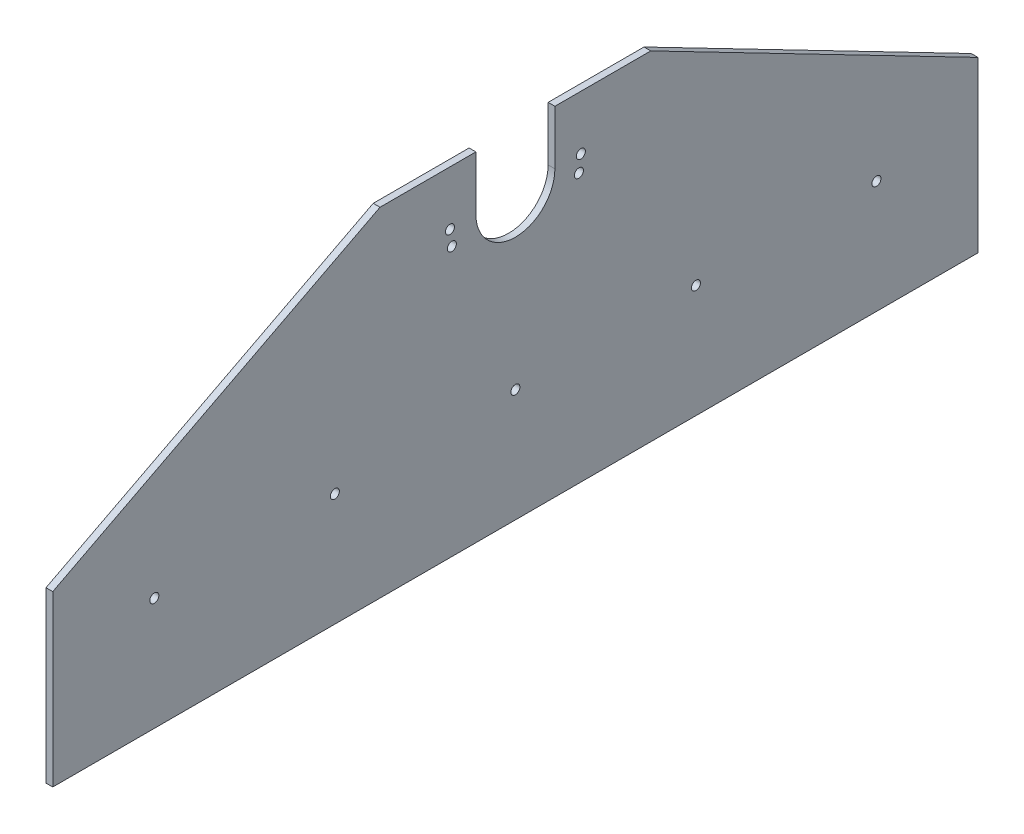
ISO-10303-21;
HEADER;
FILE_DESCRIPTION(('STEP AP214'),'2;1');
FILE_NAME('part.step','',(''),(''),'','','');
FILE_SCHEMA(('AUTOMOTIVE_DESIGN { 1 0 10303 214 1 1 1 1 }'));
ENDSEC;
DATA;
#1=APPLICATION_CONTEXT('core data for automotive mechanical design processes');
#2=APPLICATION_PROTOCOL_DEFINITION('international standard','automotive_design',2000,#1);
#3=PRODUCT_CONTEXT('',#1,'mechanical');
#4=PRODUCT('Part','Part','',(#3));
#5=PRODUCT_RELATED_PRODUCT_CATEGORY('part','',(#4));
#6=PRODUCT_DEFINITION_FORMATION('','',#4);
#7=PRODUCT_DEFINITION_CONTEXT('part definition',#1,'design');
#8=PRODUCT_DEFINITION('design','',#6,#7);
#9=PRODUCT_DEFINITION_SHAPE('','',#8);
#10=(LENGTH_UNIT() NAMED_UNIT(*) SI_UNIT(.MILLI.,.METRE.));
#11=(NAMED_UNIT(*) PLANE_ANGLE_UNIT() SI_UNIT($,.RADIAN.));
#12=(NAMED_UNIT(*) SI_UNIT($,.STERADIAN.) SOLID_ANGLE_UNIT());
#13=UNCERTAINTY_MEASURE_WITH_UNIT(LENGTH_MEASURE(1.E-05),#10,'distance_accuracy_value','');
#14=(GEOMETRIC_REPRESENTATION_CONTEXT(3) GLOBAL_UNCERTAINTY_ASSIGNED_CONTEXT((#13)) GLOBAL_UNIT_ASSIGNED_CONTEXT((#10,
#11,#12)) REPRESENTATION_CONTEXT('',''));
#15=CARTESIAN_POINT('',(0.,0.,0.));
#16=DIRECTION('',(0.,0.,1.));
#17=DIRECTION('',(1.,0.,0.));
#18=AXIS2_PLACEMENT_3D('',#15,#16,#17);
#19=CARTESIAN_POINT('',(3.,150.,0.));
#20=DIRECTION('',(0.,-1.,0.));
#21=DIRECTION('',(0.,0.,-1.));
#22=AXIS2_PLACEMENT_3D('',#19,#20,#21);
#23=PLANE('',#22);
#24=DIRECTION('',(0.,0.,1.));
#25=VECTOR('',#24,1.);
#26=CARTESIAN_POINT('',(3.,150.,0.));
#27=LINE('',#26,#25);
#28=CARTESIAN_POINT('',(3.,150.,-187.5));
#29=VERTEX_POINT('',#28);
#30=CARTESIAN_POINT('',(3.,150.,-145.));
#31=VERTEX_POINT('',#30);
#32=EDGE_CURVE('E202',#29,#31,#27,.T.);
#33=ORIENTED_EDGE('',*,*,#32,.F.);
#34=DIRECTION('',(1.,0.,0.));
#35=VECTOR('',#34,1.);
#36=CARTESIAN_POINT('',(-7.,150.,-187.5));
#37=LINE('',#36,#35);
#38=CARTESIAN_POINT('',(0.,150.,-187.5));
#39=VERTEX_POINT('',#38);
#40=EDGE_CURVE('E235',#39,#29,#37,.T.);
#41=ORIENTED_EDGE('',*,*,#40,.F.);
#42=DIRECTION('',(0.,0.,1.));
#43=VECTOR('',#42,1.);
#44=CARTESIAN_POINT('',(0.,150.,0.));
#45=LINE('',#44,#43);
#46=CARTESIAN_POINT('',(0.,150.,-145.));
#47=VERTEX_POINT('',#46);
#48=EDGE_CURVE('E211',#39,#47,#45,.T.);
#49=ORIENTED_EDGE('',*,*,#48,.T.);
#50=DIRECTION('',(1.,0.,0.));
#51=VECTOR('',#50,1.);
#52=CARTESIAN_POINT('',(0.,150.,-145.));
#53=LINE('',#52,#51);
#54=EDGE_CURVE('E189',#47,#31,#53,.T.);
#55=ORIENTED_EDGE('',*,*,#54,.T.);
#56=EDGE_LOOP('',(#33,#41,#49,#55));
#57=FACE_BOUND('',#56,.T.);
#58=ADVANCED_FACE('F32',(#57),#23,.F.);
#59=CARTESIAN_POINT('',(-7.,126.,-205.));
#60=DIRECTION('',(1.,0.,0.));
#61=DIRECTION('',(0.,0.,-1.));
#62=AXIS2_PLACEMENT_3D('',#59,#60,#61);
#63=CYLINDRICAL_SURFACE('',#62,17.5);
#64=DIRECTION('',(1.,0.,0.));
#65=VECTOR('',#64,1.);
#66=CARTESIAN_POINT('',(-7.,126.,-187.5));
#67=LINE('',#66,#65);
#68=CARTESIAN_POINT('',(3.,126.,-187.5));
#69=VERTEX_POINT('',#68);
#70=CARTESIAN_POINT('',(0.,126.,-187.5));
#71=VERTEX_POINT('',#70);
#72=EDGE_CURVE('E11',#69,#71,#67,.F.);
#73=ORIENTED_EDGE('',*,*,#72,.F.);
#74=CARTESIAN_POINT('',(3.,126.,-205.));
#75=DIRECTION('',(1.,0.,0.));
#76=DIRECTION('',(0.,0.,-1.));
#77=AXIS2_PLACEMENT_3D('',#74,#75,#76);
#78=CIRCLE('',#77,17.5);
#79=CARTESIAN_POINT('',(3.,126.,-222.5));
#80=VERTEX_POINT('',#79);
#81=EDGE_CURVE('E118',#69,#80,#78,.T.);
#82=ORIENTED_EDGE('',*,*,#81,.T.);
#83=DIRECTION('',(1.,0.,0.));
#84=VECTOR('',#83,1.);
#85=CARTESIAN_POINT('',(-7.,126.,-222.5));
#86=LINE('',#85,#84);
#87=CARTESIAN_POINT('',(0.,126.,-222.5));
#88=VERTEX_POINT('',#87);
#89=EDGE_CURVE('E40',#80,#88,#86,.F.);
#90=ORIENTED_EDGE('',*,*,#89,.T.);
#91=CARTESIAN_POINT('',(0.,126.,-205.));
#92=DIRECTION('',(-1.,0.,0.));
#93=DIRECTION('',(0.,0.,1.));
#94=AXIS2_PLACEMENT_3D('',#91,#92,#93);
#95=CIRCLE('',#94,17.5);
#96=EDGE_CURVE('E124',#88,#71,#95,.T.);
#97=ORIENTED_EDGE('',*,*,#96,.T.);
#98=EDGE_LOOP('',(#73,#82,#90,#97));
#99=FACE_BOUND('',#98,.T.);
#100=ADVANCED_FACE('F123',(#99),#63,.F.);
#101=CARTESIAN_POINT('',(3.,0.,0.));
#102=DIRECTION('',(0.,0.,-1.));
#103=DIRECTION('',(-1.,0.,0.));
#104=AXIS2_PLACEMENT_3D('',#101,#102,#103);
#105=PLANE('',#104);
#106=DIRECTION('',(0.,-1.,0.));
#107=VECTOR('',#106,1.);
#108=CARTESIAN_POINT('',(3.,0.,0.));
#109=LINE('',#108,#107);
#110=CARTESIAN_POINT('',(3.,75.,0.));
#111=VERTEX_POINT('',#110);
#112=CARTESIAN_POINT('',(3.,0.,0.));
#113=VERTEX_POINT('',#112);
#114=EDGE_CURVE('E194',#111,#113,#109,.T.);
#115=ORIENTED_EDGE('',*,*,#114,.F.);
#116=DIRECTION('',(1.,0.,0.));
#117=VECTOR('',#116,1.);
#118=CARTESIAN_POINT('',(0.,75.,0.));
#119=LINE('',#118,#117);
#120=CARTESIAN_POINT('',(0.,75.,0.));
#121=VERTEX_POINT('',#120);
#122=EDGE_CURVE('E186',#121,#111,#119,.T.);
#123=ORIENTED_EDGE('',*,*,#122,.F.);
#124=DIRECTION('',(0.,-1.,0.));
#125=VECTOR('',#124,1.);
#126=CARTESIAN_POINT('',(0.,0.,0.));
#127=LINE('',#126,#125);
#128=CARTESIAN_POINT('',(0.,0.,0.));
#129=VERTEX_POINT('',#128);
#130=EDGE_CURVE('E192',#121,#129,#127,.T.);
#131=ORIENTED_EDGE('',*,*,#130,.T.);
#132=DIRECTION('',(-1.,0.,0.));
#133=VECTOR('',#132,1.);
#134=CARTESIAN_POINT('',(3.,0.,0.));
#135=LINE('',#134,#133);
#136=EDGE_CURVE('E113',#113,#129,#135,.T.);
#137=ORIENTED_EDGE('',*,*,#136,.F.);
#138=EDGE_LOOP('',(#115,#123,#131,#137));
#139=FACE_BOUND('',#138,.T.);
#140=ADVANCED_FACE('F34',(#139),#105,.F.);
#141=CARTESIAN_POINT('',(3.,0.,0.));
#142=DIRECTION('',(0.,1.,0.));
#143=DIRECTION('',(0.,0.,1.));
#144=AXIS2_PLACEMENT_3D('',#141,#142,#143);
#145=PLANE('',#144);
#146=DIRECTION('',(0.,0.,-1.));
#147=VECTOR('',#146,1.);
#148=CARTESIAN_POINT('',(0.,0.,0.));
#149=LINE('',#148,#147);
#150=CARTESIAN_POINT('',(0.,0.,-410.));
#151=VERTEX_POINT('',#150);
#152=EDGE_CURVE('E206',#129,#151,#149,.T.);
#153=ORIENTED_EDGE('',*,*,#152,.T.);
#154=DIRECTION('',(-1.,0.,0.));
#155=VECTOR('',#154,1.);
#156=CARTESIAN_POINT('',(3.,0.,-410.));
#157=LINE('',#156,#155);
#158=CARTESIAN_POINT('',(3.,0.,-410.));
#159=VERTEX_POINT('',#158);
#160=EDGE_CURVE('E204',#159,#151,#157,.T.);
#161=ORIENTED_EDGE('',*,*,#160,.F.);
#162=DIRECTION('',(0.,0.,-1.));
#163=VECTOR('',#162,1.);
#164=CARTESIAN_POINT('',(3.,0.,0.));
#165=LINE('',#164,#163);
#166=EDGE_CURVE('E196',#113,#159,#165,.T.);
#167=ORIENTED_EDGE('',*,*,#166,.F.);
#168=ORIENTED_EDGE('',*,*,#136,.T.);
#169=EDGE_LOOP('',(#153,#161,#167,#168));
#170=FACE_BOUND('',#169,.T.);
#171=ADVANCED_FACE('F262',(#170),#145,.F.);
#172=CARTESIAN_POINT('',(3.,0.,-410.));
#173=DIRECTION('',(0.,0.,1.));
#174=DIRECTION('',(1.,0.,0.));
#175=AXIS2_PLACEMENT_3D('',#172,#173,#174);
#176=PLANE('',#175);
#177=DIRECTION('',(0.,1.,0.));
#178=VECTOR('',#177,1.);
#179=CARTESIAN_POINT('',(0.,0.,-410.));
#180=LINE('',#179,#178);
#181=CARTESIAN_POINT('',(0.,74.9999999999997,-410.));
#182=VERTEX_POINT('',#181);
#183=EDGE_CURVE('E208',#151,#182,#180,.T.);
#184=ORIENTED_EDGE('',*,*,#183,.T.);
#185=DIRECTION('',(1.,0.,0.));
#186=VECTOR('',#185,1.);
#187=CARTESIAN_POINT('',(0.,74.9999999999997,-410.));
#188=LINE('',#187,#186);
#189=CARTESIAN_POINT('',(3.,74.9999999999997,-410.));
#190=VERTEX_POINT('',#189);
#191=EDGE_CURVE('E178',#182,#190,#188,.T.);
#192=ORIENTED_EDGE('',*,*,#191,.T.);
#193=DIRECTION('',(0.,1.,0.));
#194=VECTOR('',#193,1.);
#195=CARTESIAN_POINT('',(3.,0.,-410.));
#196=LINE('',#195,#194);
#197=EDGE_CURVE('E199',#159,#190,#196,.T.);
#198=ORIENTED_EDGE('',*,*,#197,.F.);
#199=ORIENTED_EDGE('',*,*,#160,.T.);
#200=EDGE_LOOP('',(#184,#192,#198,#199));
#201=FACE_BOUND('',#200,.T.);
#202=ADVANCED_FACE('F265',(#201),#176,.F.);
#203=CARTESIAN_POINT('',(0.,150.,-265.));
#204=VERTEX_POINT('',#203);
#205=CARTESIAN_POINT('',(0.,150.,-222.5));
#206=VERTEX_POINT('',#205);
#207=EDGE_CURVE('E197',#204,#206,#45,.T.);
#208=ORIENTED_EDGE('',*,*,#207,.T.);
#209=DIRECTION('',(1.,0.,0.));
#210=VECTOR('',#209,1.);
#211=CARTESIAN_POINT('',(-7.,150.,-222.5));
#212=LINE('',#211,#210);
#213=CARTESIAN_POINT('',(3.,150.,-222.5));
#214=VERTEX_POINT('',#213);
#215=EDGE_CURVE('E236',#206,#214,#212,.T.);
#216=ORIENTED_EDGE('',*,*,#215,.T.);
#217=CARTESIAN_POINT('',(3.,150.,-265.));
#218=VERTEX_POINT('',#217);
#219=EDGE_CURVE('E121',#218,#214,#27,.T.);
#220=ORIENTED_EDGE('',*,*,#219,.F.);
#221=DIRECTION('',(1.,0.,0.));
#222=VECTOR('',#221,1.);
#223=CARTESIAN_POINT('',(0.,150.,-265.));
#224=LINE('',#223,#222);
#225=EDGE_CURVE('E176',#204,#218,#224,.T.);
#226=ORIENTED_EDGE('',*,*,#225,.F.);
#227=EDGE_LOOP('',(#208,#216,#220,#226));
#228=FACE_BOUND('',#227,.T.);
#229=ADVANCED_FACE('F269',(#228),#23,.F.);
#230=CARTESIAN_POINT('',(3.,0.,0.));
#231=DIRECTION('',(-1.,0.,0.));
#232=DIRECTION('',(0.,0.,1.));
#233=AXIS2_PLACEMENT_3D('',#230,#231,#232);
#234=PLANE('',#233);
#235=CARTESIAN_POINT('',(3.,126.,-234.));
#236=DIRECTION('',(1.,0.,0.));
#237=DIRECTION('',(0.,0.,1.));
#238=AXIS2_PLACEMENT_3D('',#235,#236,#237);
#239=CIRCLE('',#238,2.);
#240=CARTESIAN_POINT('',(3.,126.,-232.));
#241=VERTEX_POINT('',#240);
#242=EDGE_CURVE('E224',#241,#241,#239,.T.);
#243=ORIENTED_EDGE('',*,*,#242,.F.);
#244=EDGE_LOOP('',(#243));
#245=FACE_BOUND('',#244,.T.);
#246=CARTESIAN_POINT('',(3.,119.051188950619,-233.155));
#247=DIRECTION('',(1.,0.,0.));
#248=DIRECTION('',(0.,0.,1.));
#249=AXIS2_PLACEMENT_3D('',#246,#247,#248);
#250=CIRCLE('',#249,2.);
#251=CARTESIAN_POINT('',(3.,119.051188950619,-231.155));
#252=VERTEX_POINT('',#251);
#253=EDGE_CURVE('E130',#252,#252,#250,.T.);
#254=ORIENTED_EDGE('',*,*,#253,.F.);
#255=EDGE_LOOP('',(#254));
#256=FACE_BOUND('',#255,.T.);
#257=CARTESIAN_POINT('',(3.,119.051188950619,-176.845));
#258=DIRECTION('',(1.,0.,0.));
#259=DIRECTION('',(0.,0.,-1.));
#260=AXIS2_PLACEMENT_3D('',#257,#258,#259);
#261=CIRCLE('',#260,2.);
#262=CARTESIAN_POINT('',(3.,119.051188950619,-178.845));
#263=VERTEX_POINT('',#262);
#264=EDGE_CURVE('E127',#263,#263,#261,.T.);
#265=ORIENTED_EDGE('',*,*,#264,.F.);
#266=EDGE_LOOP('',(#265));
#267=FACE_BOUND('',#266,.T.);
#268=CARTESIAN_POINT('',(3.,126.,-176.));
#269=DIRECTION('',(1.,0.,0.));
#270=DIRECTION('',(0.,0.,-1.));
#271=AXIS2_PLACEMENT_3D('',#268,#269,#270);
#272=CIRCLE('',#271,2.);
#273=CARTESIAN_POINT('',(3.,126.,-178.));
#274=VERTEX_POINT('',#273);
#275=EDGE_CURVE('E138',#274,#274,#272,.T.);
#276=ORIENTED_EDGE('',*,*,#275,.F.);
#277=EDGE_LOOP('',(#276));
#278=FACE_BOUND('',#277,.T.);
#279=CARTESIAN_POINT('',(3.,50.,-365.));
#280=DIRECTION('',(1.,0.,0.));
#281=DIRECTION('',(0.,0.,-1.));
#282=AXIS2_PLACEMENT_3D('',#279,#280,#281);
#283=CIRCLE('',#282,2.);
#284=CARTESIAN_POINT('',(3.,50.,-367.));
#285=VERTEX_POINT('',#284);
#286=EDGE_CURVE('E146',#285,#285,#283,.T.);
#287=ORIENTED_EDGE('',*,*,#286,.F.);
#288=EDGE_LOOP('',(#287));
#289=FACE_BOUND('',#288,.T.);
#290=CARTESIAN_POINT('',(3.,50.,-285.));
#291=DIRECTION('',(1.,0.,0.));
#292=DIRECTION('',(0.,0.,-1.));
#293=AXIS2_PLACEMENT_3D('',#290,#291,#292);
#294=CIRCLE('',#293,2.);
#295=CARTESIAN_POINT('',(3.,50.,-287.));
#296=VERTEX_POINT('',#295);
#297=EDGE_CURVE('E145',#296,#296,#294,.T.);
#298=ORIENTED_EDGE('',*,*,#297,.F.);
#299=EDGE_LOOP('',(#298));
#300=FACE_BOUND('',#299,.T.);
#301=CARTESIAN_POINT('',(3.,50.,-205.));
#302=DIRECTION('',(1.,0.,0.));
#303=DIRECTION('',(0.,0.,-1.));
#304=AXIS2_PLACEMENT_3D('',#301,#302,#303);
#305=CIRCLE('',#304,2.);
#306=CARTESIAN_POINT('',(3.,50.,-207.));
#307=VERTEX_POINT('',#306);
#308=EDGE_CURVE('E152',#307,#307,#305,.T.);
#309=ORIENTED_EDGE('',*,*,#308,.F.);
#310=EDGE_LOOP('',(#309));
#311=FACE_BOUND('',#310,.T.);
#312=CARTESIAN_POINT('',(3.,50.,-125.));
#313=DIRECTION('',(1.,0.,0.));
#314=DIRECTION('',(0.,0.,-1.));
#315=AXIS2_PLACEMENT_3D('',#312,#313,#314);
#316=CIRCLE('',#315,2.);
#317=CARTESIAN_POINT('',(3.,50.,-127.));
#318=VERTEX_POINT('',#317);
#319=EDGE_CURVE('E158',#318,#318,#316,.T.);
#320=ORIENTED_EDGE('',*,*,#319,.F.);
#321=EDGE_LOOP('',(#320));
#322=FACE_BOUND('',#321,.T.);
#323=CARTESIAN_POINT('',(3.,50.,-45.));
#324=DIRECTION('',(1.,0.,0.));
#325=DIRECTION('',(0.,0.,-1.));
#326=AXIS2_PLACEMENT_3D('',#323,#324,#325);
#327=CIRCLE('',#326,2.);
#328=CARTESIAN_POINT('',(3.,50.,-47.));
#329=VERTEX_POINT('',#328);
#330=EDGE_CURVE('E164',#329,#329,#327,.T.);
#331=ORIENTED_EDGE('',*,*,#330,.F.);
#332=EDGE_LOOP('',(#331));
#333=FACE_BOUND('',#332,.T.);
#334=ORIENTED_EDGE('',*,*,#81,.F.);
#335=DIRECTION('',(0.,-1.,0.));
#336=VECTOR('',#335,1.);
#337=CARTESIAN_POINT('',(3.,126.,-187.5));
#338=LINE('',#337,#336);
#339=EDGE_CURVE('E46',#29,#69,#338,.T.);
#340=ORIENTED_EDGE('',*,*,#339,.F.);
#341=ORIENTED_EDGE('',*,*,#32,.T.);
#342=DIRECTION('',(0.,0.459422918873767,-0.888217643155949));
#343=VECTOR('',#342,1.);
#344=CARTESIAN_POINT('',(3.,150.,-145.));
#345=LINE('',#344,#343);
#346=EDGE_CURVE('E181',#111,#31,#345,.T.);
#347=ORIENTED_EDGE('',*,*,#346,.F.);
#348=ORIENTED_EDGE('',*,*,#114,.T.);
#349=ORIENTED_EDGE('',*,*,#166,.T.);
#350=ORIENTED_EDGE('',*,*,#197,.T.);
#351=DIRECTION('',(0.,-0.459422918873768,-0.888217643155948));
#352=VECTOR('',#351,1.);
#353=CARTESIAN_POINT('',(3.,150.,-265.));
#354=LINE('',#353,#352);
#355=EDGE_CURVE('E170',#218,#190,#354,.T.);
#356=ORIENTED_EDGE('',*,*,#355,.F.);
#357=ORIENTED_EDGE('',*,*,#219,.T.);
#358=DIRECTION('',(0.,1.,0.));
#359=VECTOR('',#358,1.);
#360=CARTESIAN_POINT('',(3.,150.,-222.5));
#361=LINE('',#360,#359);
#362=EDGE_CURVE('E107',#80,#214,#361,.T.);
#363=ORIENTED_EDGE('',*,*,#362,.F.);
#364=EDGE_LOOP('',(#334,#340,#341,#347,#348,#349,#350,#356,#357,#363));
#365=FACE_BOUND('',#364,.T.);
#366=ADVANCED_FACE('F117',(#245,#256,#267,#278,#289,#300,#311,#322,#333,#365),#234,.F.);
#367=CARTESIAN_POINT('',(0.,0.,0.));
#368=DIRECTION('',(-1.,0.,0.));
#369=DIRECTION('',(0.,0.,1.));
#370=AXIS2_PLACEMENT_3D('',#367,#368,#369);
#371=PLANE('',#370);
#372=DIRECTION('',(0.,1.,0.));
#373=VECTOR('',#372,1.);
#374=CARTESIAN_POINT('',(0.,-2.168404344971E-13,-187.5));
#375=LINE('',#374,#373);
#376=EDGE_CURVE('E229',#71,#39,#375,.T.);
#377=ORIENTED_EDGE('',*,*,#376,.F.);
#378=ORIENTED_EDGE('',*,*,#96,.F.);
#379=DIRECTION('',(0.,-1.,0.));
#380=VECTOR('',#379,1.);
#381=CARTESIAN_POINT('',(0.,-2.57317315603226E-13,-222.5));
#382=LINE('',#381,#380);
#383=EDGE_CURVE('E54',#206,#88,#382,.T.);
#384=ORIENTED_EDGE('',*,*,#383,.F.);
#385=ORIENTED_EDGE('',*,*,#207,.F.);
#386=DIRECTION('',(0.,-0.459422918873768,-0.888217643155948));
#387=VECTOR('',#386,1.);
#388=CARTESIAN_POINT('',(0.,150.,-265.));
#389=LINE('',#388,#387);
#390=EDGE_CURVE('E173',#204,#182,#389,.T.);
#391=ORIENTED_EDGE('',*,*,#390,.T.);
#392=ORIENTED_EDGE('',*,*,#183,.F.);
#393=ORIENTED_EDGE('',*,*,#152,.F.);
#394=ORIENTED_EDGE('',*,*,#130,.F.);
#395=DIRECTION('',(0.,0.459422918873767,-0.888217643155949));
#396=VECTOR('',#395,1.);
#397=CARTESIAN_POINT('',(0.,150.,-145.));
#398=LINE('',#397,#396);
#399=EDGE_CURVE('E183',#121,#47,#398,.T.);
#400=ORIENTED_EDGE('',*,*,#399,.T.);
#401=ORIENTED_EDGE('',*,*,#48,.F.);
#402=EDGE_LOOP('',(#377,#378,#384,#385,#391,#392,#393,#394,#400,#401));
#403=FACE_BOUND('',#402,.T.);
#404=CARTESIAN_POINT('',(0.,126.,-234.));
#405=DIRECTION('',(-1.,0.,0.));
#406=DIRECTION('',(0.,0.,1.));
#407=AXIS2_PLACEMENT_3D('',#404,#405,#406);
#408=CIRCLE('',#407,2.);
#409=CARTESIAN_POINT('',(0.,126.,-232.));
#410=VERTEX_POINT('',#409);
#411=EDGE_CURVE('E222',#410,#410,#408,.T.);
#412=ORIENTED_EDGE('',*,*,#411,.F.);
#413=EDGE_LOOP('',(#412));
#414=FACE_BOUND('',#413,.T.);
#415=CARTESIAN_POINT('',(0.,119.051188950619,-233.155));
#416=DIRECTION('',(-1.,0.,0.));
#417=DIRECTION('',(0.,0.,1.));
#418=AXIS2_PLACEMENT_3D('',#415,#416,#417);
#419=CIRCLE('',#418,2.);
#420=CARTESIAN_POINT('',(0.,119.051188950619,-231.155));
#421=VERTEX_POINT('',#420);
#422=EDGE_CURVE('E125',#421,#421,#419,.T.);
#423=ORIENTED_EDGE('',*,*,#422,.F.);
#424=EDGE_LOOP('',(#423));
#425=FACE_BOUND('',#424,.T.);
#426=CARTESIAN_POINT('',(0.,119.051188950619,-176.845));
#427=DIRECTION('',(-1.,0.,0.));
#428=DIRECTION('',(0.,0.,1.));
#429=AXIS2_PLACEMENT_3D('',#426,#427,#428);
#430=CIRCLE('',#429,2.);
#431=CARTESIAN_POINT('',(0.,119.051188950619,-174.845));
#432=VERTEX_POINT('',#431);
#433=EDGE_CURVE('E137',#432,#432,#430,.T.);
#434=ORIENTED_EDGE('',*,*,#433,.F.);
#435=EDGE_LOOP('',(#434));
#436=FACE_BOUND('',#435,.T.);
#437=CARTESIAN_POINT('',(0.,126.,-176.));
#438=DIRECTION('',(-1.,0.,0.));
#439=DIRECTION('',(0.,0.,1.));
#440=AXIS2_PLACEMENT_3D('',#437,#438,#439);
#441=CIRCLE('',#440,2.);
#442=CARTESIAN_POINT('',(0.,126.,-174.));
#443=VERTEX_POINT('',#442);
#444=EDGE_CURVE('E141',#443,#443,#441,.T.);
#445=ORIENTED_EDGE('',*,*,#444,.F.);
#446=EDGE_LOOP('',(#445));
#447=FACE_BOUND('',#446,.T.);
#448=CARTESIAN_POINT('',(0.,50.,-365.));
#449=DIRECTION('',(1.,0.,0.));
#450=DIRECTION('',(0.,0.,-1.));
#451=AXIS2_PLACEMENT_3D('',#448,#449,#450);
#452=CIRCLE('',#451,2.);
#453=CARTESIAN_POINT('',(0.,50.,-367.));
#454=VERTEX_POINT('',#453);
#455=EDGE_CURVE('E142',#454,#454,#452,.T.);
#456=ORIENTED_EDGE('',*,*,#455,.T.);
#457=EDGE_LOOP('',(#456));
#458=FACE_BOUND('',#457,.T.);
#459=CARTESIAN_POINT('',(0.,50.,-285.));
#460=DIRECTION('',(1.,0.,0.));
#461=DIRECTION('',(0.,0.,-1.));
#462=AXIS2_PLACEMENT_3D('',#459,#460,#461);
#463=CIRCLE('',#462,2.);
#464=CARTESIAN_POINT('',(0.,50.,-287.));
#465=VERTEX_POINT('',#464);
#466=EDGE_CURVE('E149',#465,#465,#463,.T.);
#467=ORIENTED_EDGE('',*,*,#466,.T.);
#468=EDGE_LOOP('',(#467));
#469=FACE_BOUND('',#468,.T.);
#470=CARTESIAN_POINT('',(0.,50.,-205.));
#471=DIRECTION('',(1.,0.,0.));
#472=DIRECTION('',(0.,0.,-1.));
#473=AXIS2_PLACEMENT_3D('',#470,#471,#472);
#474=CIRCLE('',#473,2.);
#475=CARTESIAN_POINT('',(0.,50.,-207.));
#476=VERTEX_POINT('',#475);
#477=EDGE_CURVE('E155',#476,#476,#474,.T.);
#478=ORIENTED_EDGE('',*,*,#477,.T.);
#479=EDGE_LOOP('',(#478));
#480=FACE_BOUND('',#479,.T.);
#481=CARTESIAN_POINT('',(0.,50.,-125.));
#482=DIRECTION('',(1.,0.,0.));
#483=DIRECTION('',(0.,0.,-1.));
#484=AXIS2_PLACEMENT_3D('',#481,#482,#483);
#485=CIRCLE('',#484,2.);
#486=CARTESIAN_POINT('',(0.,50.,-127.));
#487=VERTEX_POINT('',#486);
#488=EDGE_CURVE('E161',#487,#487,#485,.T.);
#489=ORIENTED_EDGE('',*,*,#488,.T.);
#490=EDGE_LOOP('',(#489));
#491=FACE_BOUND('',#490,.T.);
#492=CARTESIAN_POINT('',(0.,50.,-45.));
#493=DIRECTION('',(1.,0.,0.));
#494=DIRECTION('',(0.,0.,-1.));
#495=AXIS2_PLACEMENT_3D('',#492,#493,#494);
#496=CIRCLE('',#495,2.);
#497=CARTESIAN_POINT('',(0.,50.,-47.));
#498=VERTEX_POINT('',#497);
#499=EDGE_CURVE('E167',#498,#498,#496,.T.);
#500=ORIENTED_EDGE('',*,*,#499,.T.);
#501=EDGE_LOOP('',(#500));
#502=FACE_BOUND('',#501,.T.);
#503=ADVANCED_FACE('F252',(#403,#414,#425,#436,#447,#458,#469,#480,#491,#502),#371,.T.);
#504=CARTESIAN_POINT('',(0.,150.,-145.));
#505=DIRECTION('',(0.,-0.888217643155949,-0.459422918873767));
#506=DIRECTION('',(0.,0.459422918873767,-0.888217643155949));
#507=AXIS2_PLACEMENT_3D('',#504,#505,#506);
#508=PLANE('',#507);
#509=ORIENTED_EDGE('',*,*,#346,.T.);
#510=ORIENTED_EDGE('',*,*,#54,.F.);
#511=ORIENTED_EDGE('',*,*,#399,.F.);
#512=ORIENTED_EDGE('',*,*,#122,.T.);
#513=EDGE_LOOP('',(#509,#510,#511,#512));
#514=FACE_BOUND('',#513,.T.);
#515=ADVANCED_FACE('F248',(#514),#508,.F.);
#516=CARTESIAN_POINT('',(0.,150.,-265.));
#517=DIRECTION('',(0.,-0.888217643155948,0.459422918873768));
#518=DIRECTION('',(0.,-0.459422918873768,-0.888217643155948));
#519=AXIS2_PLACEMENT_3D('',#516,#517,#518);
#520=PLANE('',#519);
#521=ORIENTED_EDGE('',*,*,#355,.T.);
#522=ORIENTED_EDGE('',*,*,#191,.F.);
#523=ORIENTED_EDGE('',*,*,#390,.F.);
#524=ORIENTED_EDGE('',*,*,#225,.T.);
#525=EDGE_LOOP('',(#521,#522,#523,#524));
#526=FACE_BOUND('',#525,.T.);
#527=ADVANCED_FACE('F271',(#526),#520,.F.);
#528=CARTESIAN_POINT('',(0.,50.,-45.));
#529=DIRECTION('',(1.,0.,0.));
#530=DIRECTION('',(0.,0.,-1.));
#531=AXIS2_PLACEMENT_3D('',#528,#529,#530);
#532=CYLINDRICAL_SURFACE('',#531,2.);
#533=ORIENTED_EDGE('',*,*,#499,.F.);
#534=EDGE_LOOP('',(#533));
#535=FACE_BOUND('',#534,.T.);
#536=ORIENTED_EDGE('',*,*,#330,.T.);
#537=EDGE_LOOP('',(#536));
#538=FACE_BOUND('',#537,.T.);
#539=ADVANCED_FACE('F273',(#535,#538),#532,.F.);
#540=CARTESIAN_POINT('',(0.,50.,-125.));
#541=DIRECTION('',(1.,0.,0.));
#542=DIRECTION('',(0.,0.,-1.));
#543=AXIS2_PLACEMENT_3D('',#540,#541,#542);
#544=CYLINDRICAL_SURFACE('',#543,2.);
#545=ORIENTED_EDGE('',*,*,#488,.F.);
#546=EDGE_LOOP('',(#545));
#547=FACE_BOUND('',#546,.T.);
#548=ORIENTED_EDGE('',*,*,#319,.T.);
#549=EDGE_LOOP('',(#548));
#550=FACE_BOUND('',#549,.T.);
#551=ADVANCED_FACE('F279',(#547,#550),#544,.F.);
#552=CARTESIAN_POINT('',(0.,50.,-205.));
#553=DIRECTION('',(1.,0.,0.));
#554=DIRECTION('',(0.,0.,-1.));
#555=AXIS2_PLACEMENT_3D('',#552,#553,#554);
#556=CYLINDRICAL_SURFACE('',#555,2.);
#557=ORIENTED_EDGE('',*,*,#477,.F.);
#558=EDGE_LOOP('',(#557));
#559=FACE_BOUND('',#558,.T.);
#560=ORIENTED_EDGE('',*,*,#308,.T.);
#561=EDGE_LOOP('',(#560));
#562=FACE_BOUND('',#561,.T.);
#563=ADVANCED_FACE('F376',(#559,#562),#556,.F.);
#564=CARTESIAN_POINT('',(0.,50.,-285.));
#565=DIRECTION('',(1.,0.,0.));
#566=DIRECTION('',(0.,0.,-1.));
#567=AXIS2_PLACEMENT_3D('',#564,#565,#566);
#568=CYLINDRICAL_SURFACE('',#567,2.);
#569=ORIENTED_EDGE('',*,*,#466,.F.);
#570=EDGE_LOOP('',(#569));
#571=FACE_BOUND('',#570,.T.);
#572=ORIENTED_EDGE('',*,*,#297,.T.);
#573=EDGE_LOOP('',(#572));
#574=FACE_BOUND('',#573,.T.);
#575=ADVANCED_FACE('F372',(#571,#574),#568,.F.);
#576=CARTESIAN_POINT('',(0.,50.,-365.));
#577=DIRECTION('',(1.,0.,0.));
#578=DIRECTION('',(0.,0.,-1.));
#579=AXIS2_PLACEMENT_3D('',#576,#577,#578);
#580=CYLINDRICAL_SURFACE('',#579,2.);
#581=ORIENTED_EDGE('',*,*,#455,.F.);
#582=EDGE_LOOP('',(#581));
#583=FACE_BOUND('',#582,.T.);
#584=ORIENTED_EDGE('',*,*,#286,.T.);
#585=EDGE_LOOP('',(#584));
#586=FACE_BOUND('',#585,.T.);
#587=ADVANCED_FACE('F368',(#583,#586),#580,.F.);
#588=CARTESIAN_POINT('',(-7.,126.,-176.));
#589=DIRECTION('',(1.,0.,0.));
#590=DIRECTION('',(0.,0.,-1.));
#591=AXIS2_PLACEMENT_3D('',#588,#589,#590);
#592=CYLINDRICAL_SURFACE('',#591,2.);
#593=ORIENTED_EDGE('',*,*,#444,.T.);
#594=EDGE_LOOP('',(#593));
#595=FACE_BOUND('',#594,.T.);
#596=ORIENTED_EDGE('',*,*,#275,.T.);
#597=EDGE_LOOP('',(#596));
#598=FACE_BOUND('',#597,.T.);
#599=ADVANCED_FACE('F364',(#595,#598),#592,.F.);
#600=CARTESIAN_POINT('',(-7.,119.051188950619,-176.845));
#601=DIRECTION('',(1.,0.,0.));
#602=DIRECTION('',(0.,0.,-1.));
#603=AXIS2_PLACEMENT_3D('',#600,#601,#602);
#604=CYLINDRICAL_SURFACE('',#603,2.);
#605=ORIENTED_EDGE('',*,*,#433,.T.);
#606=EDGE_LOOP('',(#605));
#607=FACE_BOUND('',#606,.T.);
#608=ORIENTED_EDGE('',*,*,#264,.T.);
#609=EDGE_LOOP('',(#608));
#610=FACE_BOUND('',#609,.T.);
#611=ADVANCED_FACE('F359',(#607,#610),#604,.F.);
#612=CARTESIAN_POINT('',(-7.,119.051188950619,-233.155));
#613=DIRECTION('',(1.,0.,0.));
#614=DIRECTION('',(0.,0.,-1.));
#615=AXIS2_PLACEMENT_3D('',#612,#613,#614);
#616=CYLINDRICAL_SURFACE('',#615,2.);
#617=ORIENTED_EDGE('',*,*,#422,.T.);
#618=EDGE_LOOP('',(#617));
#619=FACE_BOUND('',#618,.T.);
#620=ORIENTED_EDGE('',*,*,#253,.T.);
#621=EDGE_LOOP('',(#620));
#622=FACE_BOUND('',#621,.T.);
#623=ADVANCED_FACE('F357',(#619,#622),#616,.F.);
#624=CARTESIAN_POINT('',(-7.,126.,-234.));
#625=DIRECTION('',(1.,0.,0.));
#626=DIRECTION('',(0.,0.,-1.));
#627=AXIS2_PLACEMENT_3D('',#624,#625,#626);
#628=CYLINDRICAL_SURFACE('',#627,2.);
#629=ORIENTED_EDGE('',*,*,#411,.T.);
#630=EDGE_LOOP('',(#629));
#631=FACE_BOUND('',#630,.T.);
#632=ORIENTED_EDGE('',*,*,#242,.T.);
#633=EDGE_LOOP('',(#632));
#634=FACE_BOUND('',#633,.T.);
#635=ADVANCED_FACE('F342',(#631,#634),#628,.F.);
#636=CARTESIAN_POINT('',(-7.,150.,-222.5));
#637=DIRECTION('',(0.,0.,-1.));
#638=DIRECTION('',(0.,1.,0.));
#639=AXIS2_PLACEMENT_3D('',#636,#637,#638);
#640=PLANE('',#639);
#641=ORIENTED_EDGE('',*,*,#383,.T.);
#642=ORIENTED_EDGE('',*,*,#89,.F.);
#643=ORIENTED_EDGE('',*,*,#362,.T.);
#644=ORIENTED_EDGE('',*,*,#215,.F.);
#645=EDGE_LOOP('',(#641,#642,#643,#644));
#646=FACE_BOUND('',#645,.T.);
#647=ADVANCED_FACE('F106',(#646),#640,.F.);
#648=CARTESIAN_POINT('',(-7.,126.,-187.5));
#649=DIRECTION('',(0.,0.,1.));
#650=DIRECTION('',(0.,-1.,0.));
#651=AXIS2_PLACEMENT_3D('',#648,#649,#650);
#652=PLANE('',#651);
#653=ORIENTED_EDGE('',*,*,#376,.T.);
#654=ORIENTED_EDGE('',*,*,#40,.T.);
#655=ORIENTED_EDGE('',*,*,#339,.T.);
#656=ORIENTED_EDGE('',*,*,#72,.T.);
#657=EDGE_LOOP('',(#653,#654,#655,#656));
#658=FACE_BOUND('',#657,.T.);
#659=ADVANCED_FACE('F240',(#658),#652,.F.);
#660=CLOSED_SHELL('',(#58,#100,#140,#171,#202,#229,#366,#503,#515,#527,#539,#551,#563,#575,#587,
#599,#611,#623,#635,#647,#659));
#661=MANIFOLD_SOLID_BREP('B2',#660);
#662=ADVANCED_BREP_SHAPE_REPRESENTATION('',(#18,#661),#14);
#663=SHAPE_DEFINITION_REPRESENTATION(#9,#662);
ENDSEC;
END-ISO-10303-21;
